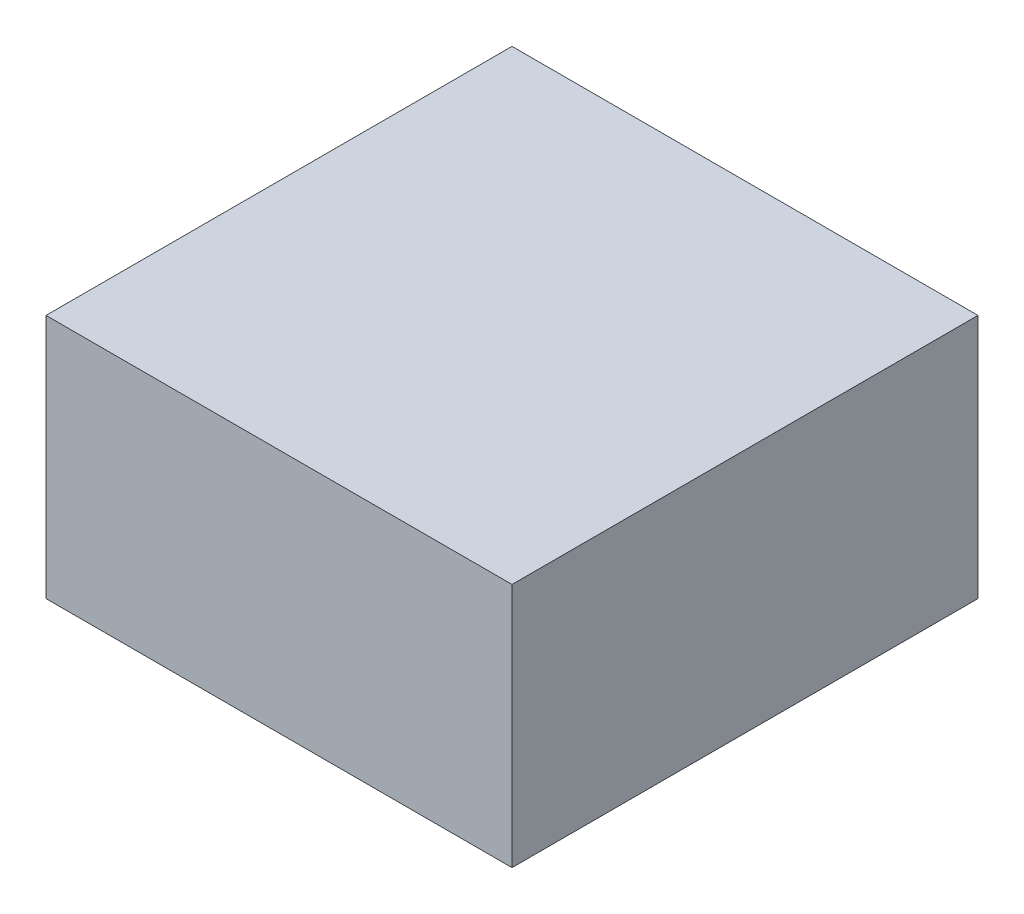
ISO-10303-21;
HEADER;
FILE_DESCRIPTION(('STEP AP214'),'2;1');
FILE_NAME('part.step','',(''),(''),'','','');
FILE_SCHEMA(('AUTOMOTIVE_DESIGN { 1 0 10303 214 1 1 1 1 }'));
ENDSEC;
DATA;
#1=APPLICATION_CONTEXT('core data for automotive mechanical design processes');
#2=APPLICATION_PROTOCOL_DEFINITION('international standard','automotive_design',2000,#1);
#3=PRODUCT_CONTEXT('',#1,'mechanical');
#4=PRODUCT('Part','Part','',(#3));
#5=PRODUCT_RELATED_PRODUCT_CATEGORY('part','',(#4));
#6=PRODUCT_DEFINITION_FORMATION('','',#4);
#7=PRODUCT_DEFINITION_CONTEXT('part definition',#1,'design');
#8=PRODUCT_DEFINITION('design','',#6,#7);
#9=PRODUCT_DEFINITION_SHAPE('','',#8);
#10=(LENGTH_UNIT() NAMED_UNIT(*) SI_UNIT(.MILLI.,.METRE.));
#11=(NAMED_UNIT(*) PLANE_ANGLE_UNIT() SI_UNIT($,.RADIAN.));
#12=(NAMED_UNIT(*) SI_UNIT($,.STERADIAN.) SOLID_ANGLE_UNIT());
#13=UNCERTAINTY_MEASURE_WITH_UNIT(LENGTH_MEASURE(1.E-05),#10,'distance_accuracy_value','');
#14=(GEOMETRIC_REPRESENTATION_CONTEXT(3) GLOBAL_UNCERTAINTY_ASSIGNED_CONTEXT((#13)) GLOBAL_UNIT_ASSIGNED_CONTEXT((#10,
#11,#12)) REPRESENTATION_CONTEXT('',''));
#15=CARTESIAN_POINT('',(0.,0.,0.));
#16=DIRECTION('',(0.,0.,1.));
#17=DIRECTION('',(1.,0.,0.));
#18=AXIS2_PLACEMENT_3D('',#15,#16,#17);
#19=CARTESIAN_POINT('',(-0.4826,-0.254,0.));
#20=DIRECTION('',(0.,1.,0.));
#21=DIRECTION('',(0.,0.,1.));
#22=AXIS2_PLACEMENT_3D('',#19,#20,#21);
#23=PLANE('',#22);
#24=DIRECTION('',(0.,0.,1.));
#25=VECTOR('',#24,1.);
#26=CARTESIAN_POINT('',(0.4826,-0.254,0.));
#27=LINE('',#26,#25);
#28=CARTESIAN_POINT('',(0.4826,-0.254,0.));
#29=VERTEX_POINT('',#28);
#30=CARTESIAN_POINT('',(0.4826,-0.254,0.9652));
#31=VERTEX_POINT('',#30);
#32=EDGE_CURVE('E20',#29,#31,#27,.T.);
#33=ORIENTED_EDGE('',*,*,#32,.T.);
#34=DIRECTION('',(-1.,0.,0.));
#35=VECTOR('',#34,1.);
#36=CARTESIAN_POINT('',(0.4826,-0.254,0.9652));
#37=LINE('',#36,#35);
#38=CARTESIAN_POINT('',(-0.4826,-0.254,0.9652));
#39=VERTEX_POINT('',#38);
#40=EDGE_CURVE('E55',#31,#39,#37,.T.);
#41=ORIENTED_EDGE('',*,*,#40,.T.);
#42=DIRECTION('',(0.,0.,-1.));
#43=VECTOR('',#42,1.);
#44=CARTESIAN_POINT('',(-0.4826,-0.254,0.));
#45=LINE('',#44,#43);
#46=CARTESIAN_POINT('',(-0.4826,-0.254,0.));
#47=VERTEX_POINT('',#46);
#48=EDGE_CURVE('E76',#39,#47,#45,.T.);
#49=ORIENTED_EDGE('',*,*,#48,.T.);
#50=DIRECTION('',(-1.,0.,0.));
#51=VECTOR('',#50,1.);
#52=CARTESIAN_POINT('',(0.4826,-0.254,0.));
#53=LINE('',#52,#51);
#54=EDGE_CURVE('E58',#29,#47,#53,.T.);
#55=ORIENTED_EDGE('',*,*,#54,.F.);
#56=EDGE_LOOP('',(#33,#41,#49,#55));
#57=FACE_BOUND('',#56,.T.);
#58=ADVANCED_FACE('F17',(#57),#23,.F.);
#59=CARTESIAN_POINT('',(0.4826,-0.254,0.));
#60=DIRECTION('',(-1.,0.,0.));
#61=DIRECTION('',(0.,0.,1.));
#62=AXIS2_PLACEMENT_3D('',#59,#60,#61);
#63=PLANE('',#62);
#64=DIRECTION('',(0.,0.,-1.));
#65=VECTOR('',#64,1.);
#66=CARTESIAN_POINT('',(0.4826,0.254,0.));
#67=LINE('',#66,#65);
#68=CARTESIAN_POINT('',(0.4826,0.254,0.));
#69=VERTEX_POINT('',#68);
#70=CARTESIAN_POINT('',(0.4826,0.254,0.9652));
#71=VERTEX_POINT('',#70);
#72=EDGE_CURVE('E73',#69,#71,#67,.F.);
#73=ORIENTED_EDGE('',*,*,#72,.T.);
#74=DIRECTION('',(0.,1.,0.));
#75=VECTOR('',#74,1.);
#76=CARTESIAN_POINT('',(0.4826,0.254,0.9652));
#77=LINE('',#76,#75);
#78=EDGE_CURVE('E63',#71,#31,#77,.F.);
#79=ORIENTED_EDGE('',*,*,#78,.T.);
#80=ORIENTED_EDGE('',*,*,#32,.F.);
#81=DIRECTION('',(0.,1.,0.));
#82=VECTOR('',#81,1.);
#83=CARTESIAN_POINT('',(0.4826,0.254,0.));
#84=LINE('',#83,#82);
#85=EDGE_CURVE('E78',#69,#29,#84,.F.);
#86=ORIENTED_EDGE('',*,*,#85,.F.);
#87=EDGE_LOOP('',(#73,#79,#80,#86));
#88=FACE_BOUND('',#87,.T.);
#89=ADVANCED_FACE('F72',(#88),#63,.F.);
#90=CARTESIAN_POINT('',(0.4826,0.254,0.9652));
#91=DIRECTION('',(0.,0.,-1.));
#92=DIRECTION('',(-1.,0.,0.));
#93=AXIS2_PLACEMENT_3D('',#90,#91,#92);
#94=PLANE('',#93);
#95=DIRECTION('',(0.,1.,0.));
#96=VECTOR('',#95,1.);
#97=CARTESIAN_POINT('',(-0.4826,0.254,0.9652));
#98=LINE('',#97,#96);
#99=CARTESIAN_POINT('',(-0.4826,0.254,0.9652));
#100=VERTEX_POINT('',#99);
#101=EDGE_CURVE('E69',#100,#39,#98,.F.);
#102=ORIENTED_EDGE('',*,*,#101,.T.);
#103=ORIENTED_EDGE('',*,*,#40,.F.);
#104=ORIENTED_EDGE('',*,*,#78,.F.);
#105=DIRECTION('',(1.,0.,0.));
#106=VECTOR('',#105,1.);
#107=CARTESIAN_POINT('',(0.4826,0.254,0.9652));
#108=LINE('',#107,#106);
#109=EDGE_CURVE('E83',#71,#100,#108,.F.);
#110=ORIENTED_EDGE('',*,*,#109,.T.);
#111=EDGE_LOOP('',(#102,#103,#104,#110));
#112=FACE_BOUND('',#111,.T.);
#113=ADVANCED_FACE('F66',(#112),#94,.F.);
#114=CARTESIAN_POINT('',(-0.4826,0.254,0.));
#115=DIRECTION('',(1.,0.,0.));
#116=DIRECTION('',(0.,0.,-1.));
#117=AXIS2_PLACEMENT_3D('',#114,#115,#116);
#118=PLANE('',#117);
#119=ORIENTED_EDGE('',*,*,#48,.F.);
#120=ORIENTED_EDGE('',*,*,#101,.F.);
#121=DIRECTION('',(0.,0.,-1.));
#122=VECTOR('',#121,1.);
#123=CARTESIAN_POINT('',(-0.4826,0.254,0.));
#124=LINE('',#123,#122);
#125=CARTESIAN_POINT('',(-0.4826,0.254,0.));
#126=VERTEX_POINT('',#125);
#127=EDGE_CURVE('E26',#100,#126,#124,.T.);
#128=ORIENTED_EDGE('',*,*,#127,.T.);
#129=DIRECTION('',(0.,1.,0.));
#130=VECTOR('',#129,1.);
#131=CARTESIAN_POINT('',(-0.4826,0.254,0.));
#132=LINE('',#131,#130);
#133=EDGE_CURVE('E34',#47,#126,#132,.T.);
#134=ORIENTED_EDGE('',*,*,#133,.F.);
#135=EDGE_LOOP('',(#119,#120,#128,#134));
#136=FACE_BOUND('',#135,.T.);
#137=ADVANCED_FACE('F88',(#136),#118,.F.);
#138=CARTESIAN_POINT('',(0.4826,0.254,0.));
#139=DIRECTION('',(0.,0.,-1.));
#140=DIRECTION('',(-1.,0.,0.));
#141=AXIS2_PLACEMENT_3D('',#138,#139,#140);
#142=PLANE('',#141);
#143=ORIENTED_EDGE('',*,*,#133,.T.);
#144=DIRECTION('',(1.,0.,0.));
#145=VECTOR('',#144,1.);
#146=CARTESIAN_POINT('',(0.4826,0.254,0.));
#147=LINE('',#146,#145);
#148=EDGE_CURVE('E11',#126,#69,#147,.T.);
#149=ORIENTED_EDGE('',*,*,#148,.T.);
#150=ORIENTED_EDGE('',*,*,#85,.T.);
#151=ORIENTED_EDGE('',*,*,#54,.T.);
#152=EDGE_LOOP('',(#143,#149,#150,#151));
#153=FACE_BOUND('',#152,.T.);
#154=ADVANCED_FACE('F91',(#153),#142,.T.);
#155=CARTESIAN_POINT('',(0.4826,0.254,0.));
#156=DIRECTION('',(0.,-1.,0.));
#157=DIRECTION('',(0.,0.,-1.));
#158=AXIS2_PLACEMENT_3D('',#155,#156,#157);
#159=PLANE('',#158);
#160=ORIENTED_EDGE('',*,*,#127,.F.);
#161=ORIENTED_EDGE('',*,*,#109,.F.);
#162=ORIENTED_EDGE('',*,*,#72,.F.);
#163=ORIENTED_EDGE('',*,*,#148,.F.);
#164=EDGE_LOOP('',(#160,#161,#162,#163));
#165=FACE_BOUND('',#164,.T.);
#166=ADVANCED_FACE('F90',(#165),#159,.F.);
#167=CLOSED_SHELL('',(#58,#89,#113,#137,#154,#166));
#168=MANIFOLD_SOLID_BREP('B1',#167);
#169=ADVANCED_BREP_SHAPE_REPRESENTATION('',(#18,#168),#14);
#170=SHAPE_DEFINITION_REPRESENTATION(#9,#169);
ENDSEC;
END-ISO-10303-21;
